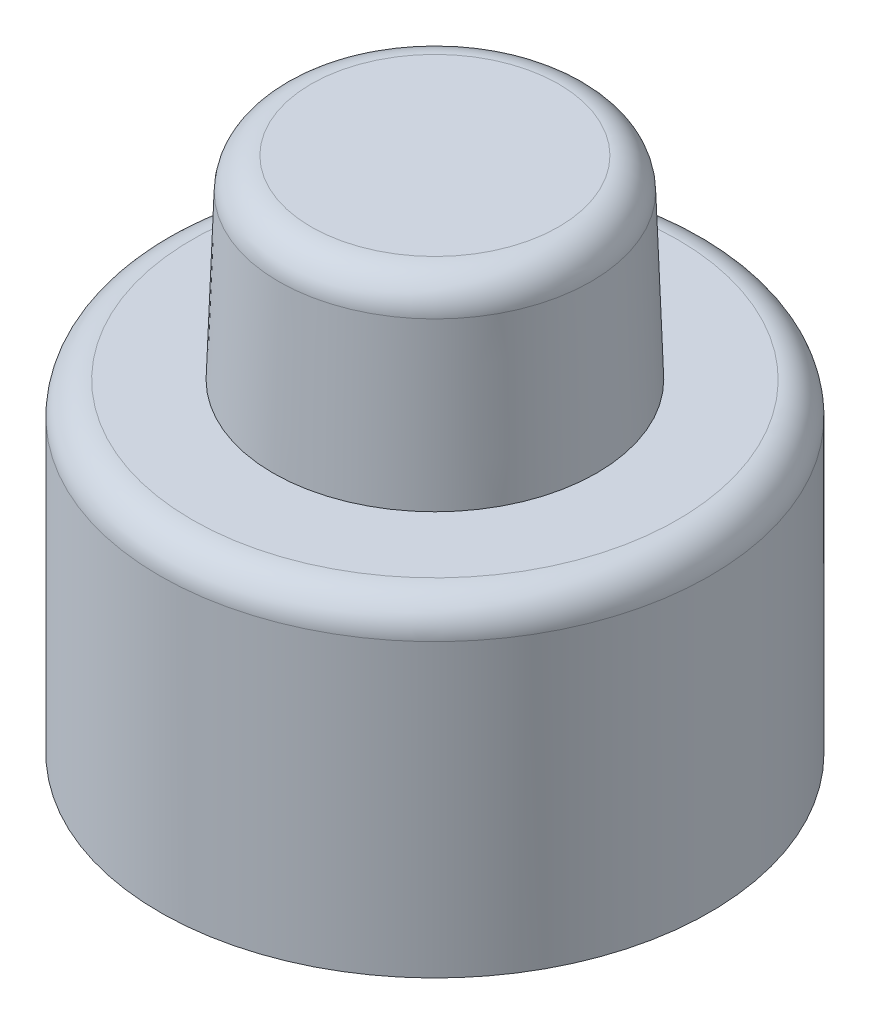
ISO-10303-21;
HEADER;
FILE_DESCRIPTION(('STEP AP214'),'2;1');
FILE_NAME('part.step','',(''),(''),'','','');
FILE_SCHEMA(('AUTOMOTIVE_DESIGN { 1 0 10303 214 1 1 1 1 }'));
ENDSEC;
DATA;
#1=APPLICATION_CONTEXT('core data for automotive mechanical design processes');
#2=APPLICATION_PROTOCOL_DEFINITION('international standard','automotive_design',2000,#1);
#3=PRODUCT_CONTEXT('',#1,'mechanical');
#4=PRODUCT('Part','Part','',(#3));
#5=PRODUCT_RELATED_PRODUCT_CATEGORY('part','',(#4));
#6=PRODUCT_DEFINITION_FORMATION('','',#4);
#7=PRODUCT_DEFINITION_CONTEXT('part definition',#1,'design');
#8=PRODUCT_DEFINITION('design','',#6,#7);
#9=PRODUCT_DEFINITION_SHAPE('','',#8);
#10=(LENGTH_UNIT() NAMED_UNIT(*) SI_UNIT(.MILLI.,.METRE.));
#11=(NAMED_UNIT(*) PLANE_ANGLE_UNIT() SI_UNIT($,.RADIAN.));
#12=(NAMED_UNIT(*) SI_UNIT($,.STERADIAN.) SOLID_ANGLE_UNIT());
#13=UNCERTAINTY_MEASURE_WITH_UNIT(LENGTH_MEASURE(1.E-05),#10,'distance_accuracy_value','');
#14=(GEOMETRIC_REPRESENTATION_CONTEXT(3) GLOBAL_UNCERTAINTY_ASSIGNED_CONTEXT((#13)) GLOBAL_UNIT_ASSIGNED_CONTEXT((#10,
#11,#12)) REPRESENTATION_CONTEXT('',''));
#15=CARTESIAN_POINT('',(0.,0.,0.));
#16=DIRECTION('',(0.,0.,1.));
#17=DIRECTION('',(1.,0.,0.));
#18=AXIS2_PLACEMENT_3D('',#15,#16,#17);
#19=CARTESIAN_POINT('',(-51.6201704164734,-4.,0.));
#20=DIRECTION('',(1.,0.,0.));
#21=DIRECTION('',(0.,0.,-1.));
#22=AXIS2_PLACEMENT_3D('',#19,#20,#21);
#23=PLANE('',#22);
#24=DIRECTION('',(0.,0.,1.));
#25=VECTOR('',#24,1.);
#26=CARTESIAN_POINT('',(-51.6201704164734,3.,0.));
#27=LINE('',#26,#25);
#28=CARTESIAN_POINT('',(-51.6201704164734,3.,-8.48528137423857));
#29=VERTEX_POINT('',#28);
#30=CARTESIAN_POINT('',(-51.6201704164734,3.,-6.48528137423857));
#31=VERTEX_POINT('',#30);
#32=EDGE_CURVE('E106',#29,#31,#27,.T.);
#33=ORIENTED_EDGE('',*,*,#32,.T.);
#34=DIRECTION('',(0.,1.,0.));
#35=VECTOR('',#34,1.);
#36=CARTESIAN_POINT('',(-51.6201704164734,3.,-6.48528137423857));
#37=LINE('',#36,#35);
#38=CARTESIAN_POINT('',(-51.6201704164734,-4.,-6.48528137423857));
#39=VERTEX_POINT('',#38);
#40=EDGE_CURVE('E57',#39,#31,#37,.T.);
#41=ORIENTED_EDGE('',*,*,#40,.F.);
#42=DIRECTION('',(0.,0.,-1.));
#43=VECTOR('',#42,1.);
#44=CARTESIAN_POINT('',(-51.6201704164734,-4.,0.));
#45=LINE('',#44,#43);
#46=CARTESIAN_POINT('',(-51.6201704164734,-4.,-8.48528137423857));
#47=VERTEX_POINT('',#46);
#48=EDGE_CURVE('E64',#39,#47,#45,.T.);
#49=ORIENTED_EDGE('',*,*,#48,.T.);
#50=DIRECTION('',(0.,1.,0.));
#51=VECTOR('',#50,1.);
#52=CARTESIAN_POINT('',(-51.6201704164734,-4.,-8.48528137423857));
#53=LINE('',#52,#51);
#54=EDGE_CURVE('E121',#47,#29,#53,.T.);
#55=ORIENTED_EDGE('',*,*,#54,.T.);
#56=EDGE_LOOP('',(#33,#41,#49,#55));
#57=FACE_BOUND('',#56,.T.);
#58=ADVANCED_FACE('F41',(#57),#23,.T.);
#59=CARTESIAN_POINT('',(-46.6165479283482,-4.,0.));
#60=DIRECTION('',(-1.,0.,0.));
#61=DIRECTION('',(0.,0.,1.));
#62=AXIS2_PLACEMENT_3D('',#59,#60,#61);
#63=PLANE('',#62);
#64=DIRECTION('',(0.,0.,1.));
#65=VECTOR('',#64,1.);
#66=CARTESIAN_POINT('',(-46.6165479283482,-4.,0.));
#67=LINE('',#66,#65);
#68=CARTESIAN_POINT('',(-46.6165479283482,-4.,-7.20884071709545));
#69=VERTEX_POINT('',#68);
#70=CARTESIAN_POINT('',(-46.6165479283482,-4.,-6.48528137423857));
#71=VERTEX_POINT('',#70);
#72=EDGE_CURVE('E97',#69,#71,#67,.T.);
#73=ORIENTED_EDGE('',*,*,#72,.T.);
#74=DIRECTION('',(0.,-1.,0.));
#75=VECTOR('',#74,1.);
#76=CARTESIAN_POINT('',(-46.6165479283482,3.,-6.48528137423857));
#77=LINE('',#76,#75);
#78=CARTESIAN_POINT('',(-46.6165479283482,3.,-6.48528137423857));
#79=VERTEX_POINT('',#78);
#80=EDGE_CURVE('E83',#79,#71,#77,.T.);
#81=ORIENTED_EDGE('',*,*,#80,.F.);
#82=DIRECTION('',(0.,0.,-1.));
#83=VECTOR('',#82,1.);
#84=CARTESIAN_POINT('',(-46.6165479283482,3.,0.));
#85=LINE('',#84,#83);
#86=CARTESIAN_POINT('',(-46.6165479283482,3.,-7.20884071709545));
#87=VERTEX_POINT('',#86);
#88=EDGE_CURVE('E94',#79,#87,#85,.T.);
#89=ORIENTED_EDGE('',*,*,#88,.T.);
#90=DIRECTION('',(0.,1.,0.));
#91=VECTOR('',#90,1.);
#92=CARTESIAN_POINT('',(-46.6165479283482,-4.,-7.20884071709545));
#93=LINE('',#92,#91);
#94=EDGE_CURVE('E124',#69,#87,#93,.T.);
#95=ORIENTED_EDGE('',*,*,#94,.F.);
#96=EDGE_LOOP('',(#73,#81,#89,#95));
#97=FACE_BOUND('',#96,.T.);
#98=ADVANCED_FACE('F93',(#97),#63,.T.);
#99=CARTESIAN_POINT('',(0.,3.,0.));
#100=DIRECTION('',(0.,-1.,0.));
#101=DIRECTION('',(0.,0.,-1.));
#102=AXIS2_PLACEMENT_3D('',#99,#100,#101);
#103=PLANE('',#102);
#104=ORIENTED_EDGE('',*,*,#88,.F.);
#105=DIRECTION('',(1.,0.,0.));
#106=VECTOR('',#105,1.);
#107=CARTESIAN_POINT('',(-51.6201704164734,3.,-6.48528137423857));
#108=LINE('',#107,#106);
#109=EDGE_CURVE('E80',#31,#79,#108,.T.);
#110=ORIENTED_EDGE('',*,*,#109,.F.);
#111=ORIENTED_EDGE('',*,*,#32,.F.);
#112=CARTESIAN_POINT('',(-51.1201704164734,3.,0.));
#113=DIRECTION('',(0.,-1.,0.));
#114=DIRECTION('',(0.,0.,-1.));
#115=AXIS2_PLACEMENT_3D('',#112,#113,#114);
#116=CIRCLE('',#115,8.50000000000004);
#117=EDGE_CURVE('E104',#87,#29,#116,.F.);
#118=ORIENTED_EDGE('',*,*,#117,.F.);
#119=EDGE_LOOP('',(#104,#110,#111,#118));
#120=FACE_BOUND('',#119,.T.);
#121=ADVANCED_FACE('F102',(#120),#103,.T.);
#122=CARTESIAN_POINT('',(-51.1201704164734,6.,0.));
#123=DIRECTION('',(0.,-1.,0.));
#124=DIRECTION('',(0.,0.,-1.));
#125=AXIS2_PLACEMENT_3D('',#122,#123,#124);
#126=CYLINDRICAL_SURFACE('',#125,8.5);
#127=CARTESIAN_POINT('',(-51.1201704164734,5.,0.));
#128=DIRECTION('',(0.,1.,0.));
#129=DIRECTION('',(0.,0.,1.));
#130=AXIS2_PLACEMENT_3D('',#127,#128,#129);
#131=CIRCLE('',#130,8.5);
#132=CARTESIAN_POINT('',(-51.1201704164734,5.,8.5));
#133=VERTEX_POINT('',#132);
#134=EDGE_CURVE('E135',#133,#133,#131,.F.);
#135=ORIENTED_EDGE('',*,*,#134,.T.);
#136=EDGE_LOOP('',(#135));
#137=FACE_BOUND('',#136,.T.);
#138=ORIENTED_EDGE('',*,*,#117,.T.);
#139=ORIENTED_EDGE('',*,*,#54,.F.);
#140=CARTESIAN_POINT('',(-51.1201704164734,-4.,0.));
#141=DIRECTION('',(0.,-1.,0.));
#142=DIRECTION('',(0.,0.,-1.));
#143=AXIS2_PLACEMENT_3D('',#140,#141,#142);
#144=CIRCLE('',#143,8.5);
#145=EDGE_CURVE('E118',#69,#47,#144,.T.);
#146=ORIENTED_EDGE('',*,*,#145,.F.);
#147=ORIENTED_EDGE('',*,*,#94,.T.);
#148=EDGE_LOOP('',(#138,#139,#146,#147));
#149=FACE_BOUND('',#148,.T.);
#150=ADVANCED_FACE('F170',(#137,#149),#126,.T.);
#151=CARTESIAN_POINT('',(-51.1201704164734,6.,0.));
#152=DIRECTION('',(0.,1.,0.));
#153=DIRECTION('',(0.,0.,1.));
#154=AXIS2_PLACEMENT_3D('',#151,#152,#153);
#155=PLANE('',#154);
#156=CARTESIAN_POINT('',(-51.1201704164734,6.,0.));
#157=DIRECTION('',(0.,1.,0.));
#158=DIRECTION('',(0.,0.,1.));
#159=AXIS2_PLACEMENT_3D('',#156,#157,#158);
#160=CIRCLE('',#159,5.);
#161=CARTESIAN_POINT('',(-51.1201704164734,6.,5.));
#162=VERTEX_POINT('',#161);
#163=EDGE_CURVE('E127',#162,#162,#160,.T.);
#164=ORIENTED_EDGE('',*,*,#163,.F.);
#165=EDGE_LOOP('',(#164));
#166=FACE_BOUND('',#165,.T.);
#167=CARTESIAN_POINT('',(-51.1201704164734,6.,0.));
#168=DIRECTION('',(0.,1.,0.));
#169=DIRECTION('',(0.,0.,1.));
#170=AXIS2_PLACEMENT_3D('',#167,#168,#169);
#171=CIRCLE('',#170,7.5);
#172=CARTESIAN_POINT('',(-51.1201704164734,6.,7.5));
#173=VERTEX_POINT('',#172);
#174=EDGE_CURVE('E131',#173,#173,#171,.T.);
#175=ORIENTED_EDGE('',*,*,#174,.T.);
#176=EDGE_LOOP('',(#175));
#177=FACE_BOUND('',#176,.T.);
#178=ADVANCED_FACE('F167',(#166,#177),#155,.T.);
#179=CARTESIAN_POINT('',(-51.1201704164734,5.,0.));
#180=DIRECTION('',(0.,1.,0.));
#181=DIRECTION('',(0.,0.,1.));
#182=AXIS2_PLACEMENT_3D('',#179,#180,#181);
#183=TOROIDAL_SURFACE('',#182,7.5,1.);
#184=ORIENTED_EDGE('',*,*,#134,.F.);
#185=EDGE_LOOP('',(#184));
#186=FACE_BOUND('',#185,.T.);
#187=ORIENTED_EDGE('',*,*,#174,.F.);
#188=EDGE_LOOP('',(#187));
#189=FACE_BOUND('',#188,.T.);
#190=ADVANCED_FACE('F165',(#186,#189),#183,.T.);
#191=CARTESIAN_POINT('',(-51.1201704164734,6.,0.));
#192=DIRECTION('',(0.,-1.,0.));
#193=DIRECTION('',(0.,0.,1.));
#194=AXIS2_PLACEMENT_3D('',#191,#192,#193);
#195=CONICAL_SURFACE('',#194,5.,0.0349065850398866);
#196=CARTESIAN_POINT('',(-51.1201704164734,11.0348994967025,0.));
#197=DIRECTION('',(0.,-1.,0.));
#198=DIRECTION('',(0.,0.,-1.));
#199=AXIS2_PLACEMENT_3D('',#196,#197,#198);
#200=CIRCLE('',#199,4.82417743526153);
#201=CARTESIAN_POINT('',(-51.1201704164734,11.0348994967025,-4.82417743526153));
#202=VERTEX_POINT('',#201);
#203=EDGE_CURVE('E11',#202,#202,#200,.T.);
#204=ORIENTED_EDGE('',*,*,#203,.T.);
#205=EDGE_LOOP('',(#204));
#206=FACE_BOUND('',#205,.T.);
#207=ORIENTED_EDGE('',*,*,#163,.T.);
#208=EDGE_LOOP('',(#207));
#209=FACE_BOUND('',#208,.T.);
#210=ADVANCED_FACE('F153',(#206,#209),#195,.T.);
#211=CARTESIAN_POINT('',(-51.1201704164734,12.,0.));
#212=DIRECTION('',(0.,1.,0.));
#213=DIRECTION('',(0.,0.,1.));
#214=AXIS2_PLACEMENT_3D('',#211,#212,#213);
#215=PLANE('',#214);
#216=CARTESIAN_POINT('',(-51.1201704164734,12.,0.));
#217=DIRECTION('',(0.,1.,0.));
#218=DIRECTION('',(0.,0.,1.));
#219=AXIS2_PLACEMENT_3D('',#216,#217,#218);
#220=CIRCLE('',#219,3.82478660824244);
#221=CARTESIAN_POINT('',(-51.1201704164734,12.,3.82478660824244));
#222=VERTEX_POINT('',#221);
#223=EDGE_CURVE('E50',#222,#222,#220,.T.);
#224=ORIENTED_EDGE('',*,*,#223,.T.);
#225=EDGE_LOOP('',(#224));
#226=FACE_BOUND('',#225,.T.);
#227=ADVANCED_FACE('F142',(#226),#215,.T.);
#228=CARTESIAN_POINT('',(-51.1201704164734,11.,0.));
#229=DIRECTION('',(0.,1.,0.));
#230=DIRECTION('',(0.,0.,1.));
#231=AXIS2_PLACEMENT_3D('',#228,#229,#230);
#232=TOROIDAL_SURFACE('',#231,3.82478660824244,1.);
#233=ORIENTED_EDGE('',*,*,#203,.F.);
#234=EDGE_LOOP('',(#233));
#235=FACE_BOUND('',#234,.T.);
#236=ORIENTED_EDGE('',*,*,#223,.F.);
#237=EDGE_LOOP('',(#236));
#238=FACE_BOUND('',#237,.T.);
#239=ADVANCED_FACE('F43',(#235,#238),#232,.T.);
#240=CARTESIAN_POINT('',(0.,-4.,0.));
#241=DIRECTION('',(0.,-1.,0.));
#242=DIRECTION('',(0.,0.,-1.));
#243=AXIS2_PLACEMENT_3D('',#240,#241,#242);
#244=PLANE('',#243);
#245=ORIENTED_EDGE('',*,*,#48,.F.);
#246=DIRECTION('',(-1.,0.,0.));
#247=VECTOR('',#246,1.);
#248=CARTESIAN_POINT('',(-51.6201704164734,-4.,-6.48528137423857));
#249=LINE('',#248,#247);
#250=EDGE_CURVE('E99',#71,#39,#249,.T.);
#251=ORIENTED_EDGE('',*,*,#250,.F.);
#252=ORIENTED_EDGE('',*,*,#72,.F.);
#253=ORIENTED_EDGE('',*,*,#145,.T.);
#254=EDGE_LOOP('',(#245,#251,#252,#253));
#255=FACE_BOUND('',#254,.T.);
#256=ADVANCED_FACE('F145',(#255),#244,.T.);
#257=CARTESIAN_POINT('',(0.,0.,-6.48528137423857));
#258=DIRECTION('',(0.,0.,1.));
#259=DIRECTION('',(1.,0.,0.));
#260=AXIS2_PLACEMENT_3D('',#257,#258,#259);
#261=PLANE('',#260);
#262=ORIENTED_EDGE('',*,*,#40,.T.);
#263=ORIENTED_EDGE('',*,*,#109,.T.);
#264=ORIENTED_EDGE('',*,*,#80,.T.);
#265=ORIENTED_EDGE('',*,*,#250,.T.);
#266=EDGE_LOOP('',(#262,#263,#264,#265));
#267=FACE_BOUND('',#266,.T.);
#268=ADVANCED_FACE('F82',(#267),#261,.F.);
#269=CLOSED_SHELL('',(#58,#98,#121,#150,#178,#190,#210,#227,#239,#256,#268));
#270=MANIFOLD_SOLID_BREP('B2',#269);
#271=ADVANCED_BREP_SHAPE_REPRESENTATION('',(#18,#270),#14);
#272=SHAPE_DEFINITION_REPRESENTATION(#9,#271);
ENDSEC;
END-ISO-10303-21;
